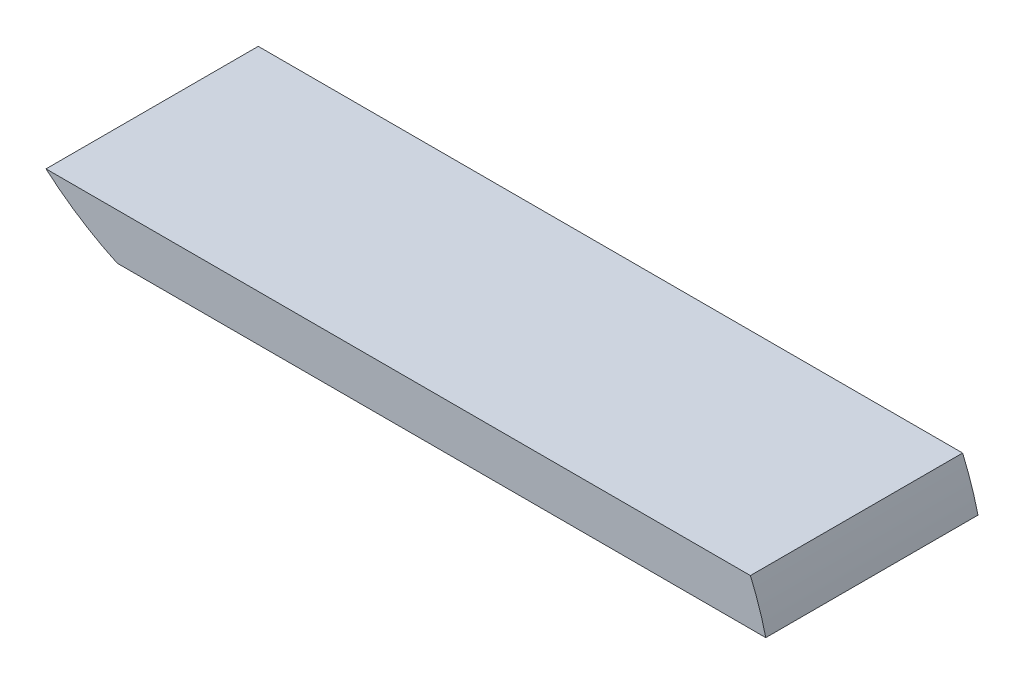
ISO-10303-21;
HEADER;
FILE_DESCRIPTION(('STEP AP214'),'2;1');
FILE_NAME('part.step','',(''),(''),'','','');
FILE_SCHEMA(('AUTOMOTIVE_DESIGN { 1 0 10303 214 1 1 1 1 }'));
ENDSEC;
DATA;
#1=APPLICATION_CONTEXT('core data for automotive mechanical design processes');
#2=APPLICATION_PROTOCOL_DEFINITION('international standard','automotive_design',2000,#1);
#3=PRODUCT_CONTEXT('',#1,'mechanical');
#4=PRODUCT('Part','Part','',(#3));
#5=PRODUCT_RELATED_PRODUCT_CATEGORY('part','',(#4));
#6=PRODUCT_DEFINITION_FORMATION('','',#4);
#7=PRODUCT_DEFINITION_CONTEXT('part definition',#1,'design');
#8=PRODUCT_DEFINITION('design','',#6,#7);
#9=PRODUCT_DEFINITION_SHAPE('','',#8);
#10=(LENGTH_UNIT() NAMED_UNIT(*) SI_UNIT(.MILLI.,.METRE.));
#11=(NAMED_UNIT(*) PLANE_ANGLE_UNIT() SI_UNIT($,.RADIAN.));
#12=(NAMED_UNIT(*) SI_UNIT($,.STERADIAN.) SOLID_ANGLE_UNIT());
#13=UNCERTAINTY_MEASURE_WITH_UNIT(LENGTH_MEASURE(1.E-05),#10,'distance_accuracy_value','');
#14=(GEOMETRIC_REPRESENTATION_CONTEXT(3) GLOBAL_UNCERTAINTY_ASSIGNED_CONTEXT((#13)) GLOBAL_UNIT_ASSIGNED_CONTEXT((#10,
#11,#12)) REPRESENTATION_CONTEXT('',''));
#15=CARTESIAN_POINT('',(0.,0.,0.));
#16=DIRECTION('',(0.,0.,1.));
#17=DIRECTION('',(1.,0.,0.));
#18=AXIS2_PLACEMENT_3D('',#15,#16,#17);
#19=CARTESIAN_POINT('',(-26.649708353736,6.037186226117,0.));
#20=DIRECTION('',(0.,-1.,0.));
#21=DIRECTION('',(1.,0.,0.));
#22=AXIS2_PLACEMENT_3D('',#19,#20,#21);
#23=PLANE('',#22);
#24=DIRECTION('',(1.,0.,0.));
#25=VECTOR('',#24,1.);
#26=CARTESIAN_POINT('',(-26.649708353736,6.037186226117,0.));
#27=LINE('',#26,#25);
#28=CARTESIAN_POINT('',(-26.649708353736,6.037186226117,0.));
#29=VERTEX_POINT('',#28);
#30=CARTESIAN_POINT('',(-26.344127417988,6.037186226117,0.));
#31=VERTEX_POINT('',#30);
#32=EDGE_CURVE('E11',#29,#31,#27,.T.);
#33=ORIENTED_EDGE('',*,*,#32,.T.);
#34=DIRECTION('',(0.,0.,1.));
#35=VECTOR('',#34,1.);
#36=CARTESIAN_POINT('',(-26.344127417988,6.037186226117,0.));
#37=LINE('',#36,#35);
#38=CARTESIAN_POINT('',(-26.344127417988,6.037186226117,0.1));
#39=VERTEX_POINT('',#38);
#40=EDGE_CURVE('E24',#31,#39,#37,.T.);
#41=ORIENTED_EDGE('',*,*,#40,.T.);
#42=DIRECTION('',(1.,0.,0.));
#43=VECTOR('',#42,1.);
#44=CARTESIAN_POINT('',(-26.649708353736,6.037186226117,0.1));
#45=LINE('',#44,#43);
#46=CARTESIAN_POINT('',(-26.649708353736,6.037186226117,0.1));
#47=VERTEX_POINT('',#46);
#48=EDGE_CURVE('E75',#47,#39,#45,.T.);
#49=ORIENTED_EDGE('',*,*,#48,.F.);
#50=DIRECTION('',(0.,0.,1.));
#51=VECTOR('',#50,1.);
#52=CARTESIAN_POINT('',(-26.649708353736,6.037186226117,0.));
#53=LINE('',#52,#51);
#54=EDGE_CURVE('E86',#29,#47,#53,.T.);
#55=ORIENTED_EDGE('',*,*,#54,.F.);
#56=EDGE_LOOP('',(#33,#41,#49,#55));
#57=FACE_BOUND('',#56,.T.);
#58=ADVANCED_FACE('F17',(#57),#23,.T.);
#59=CARTESIAN_POINT('',(-26.590617401597,6.165251438178,0.));
#60=DIRECTION('',(0.,0.,1.));
#61=DIRECTION('',(-0.656943636218161,-0.753939691774123,0.));
#62=AXIS2_PLACEMENT_3D('',#59,#60,#61);
#63=CYLINDRICAL_SURFACE('',#62,0.141040558580501);
#64=CARTESIAN_POINT('',(-26.590617401597,6.165251438178,0.));
#65=DIRECTION('',(0.,0.,1.));
#66=DIRECTION('',(-0.656943636218161,-0.753939691774123,0.));
#67=AXIS2_PLACEMENT_3D('',#64,#65,#66);
#68=CIRCLE('',#67,0.141040558580501);
#69=CARTESIAN_POINT('',(-26.683273099006,6.058915362914,0.));
#70=VERTEX_POINT('',#69);
#71=EDGE_CURVE('E83',#70,#29,#68,.T.);
#72=ORIENTED_EDGE('',*,*,#71,.T.);
#73=ORIENTED_EDGE('',*,*,#54,.T.);
#74=CARTESIAN_POINT('',(-26.590617401597,6.165251438178,0.1));
#75=DIRECTION('',(0.,0.,1.));
#76=DIRECTION('',(-0.656943636218161,-0.753939691774123,0.));
#77=AXIS2_PLACEMENT_3D('',#74,#75,#76);
#78=CIRCLE('',#77,0.141040558580501);
#79=CARTESIAN_POINT('',(-26.683273099006,6.058915362914,0.1));
#80=VERTEX_POINT('',#79);
#81=EDGE_CURVE('E81',#80,#47,#78,.T.);
#82=ORIENTED_EDGE('',*,*,#81,.F.);
#83=DIRECTION('',(0.,0.,1.));
#84=VECTOR('',#83,1.);
#85=CARTESIAN_POINT('',(-26.683273099006,6.058915362914,0.));
#86=LINE('',#85,#84);
#87=EDGE_CURVE('E61',#70,#80,#86,.T.);
#88=ORIENTED_EDGE('',*,*,#87,.F.);
#89=EDGE_LOOP('',(#72,#73,#82,#88));
#90=FACE_BOUND('',#89,.T.);
#91=ADVANCED_FACE('F91',(#90),#63,.T.);
#92=CARTESIAN_POINT('',(-26.351368278438,6.058915362914,0.));
#93=DIRECTION('',(0.,1.,0.));
#94=DIRECTION('',(-1.,0.,0.));
#95=AXIS2_PLACEMENT_3D('',#92,#93,#94);
#96=PLANE('',#95);
#97=DIRECTION('',(-1.,0.,0.));
#98=VECTOR('',#97,1.);
#99=CARTESIAN_POINT('',(-26.351368278438,6.058915362914,0.));
#100=LINE('',#99,#98);
#101=CARTESIAN_POINT('',(-26.351368278438,6.058915362914,0.));
#102=VERTEX_POINT('',#101);
#103=EDGE_CURVE('E65',#102,#70,#100,.T.);
#104=ORIENTED_EDGE('',*,*,#103,.T.);
#105=ORIENTED_EDGE('',*,*,#87,.T.);
#106=DIRECTION('',(-1.,0.,0.));
#107=VECTOR('',#106,1.);
#108=CARTESIAN_POINT('',(-26.351368278438,6.058915362914,0.1));
#109=LINE('',#108,#107);
#110=CARTESIAN_POINT('',(-26.351368278438,6.058915362914,0.1));
#111=VERTEX_POINT('',#110);
#112=EDGE_CURVE('E54',#111,#80,#109,.T.);
#113=ORIENTED_EDGE('',*,*,#112,.F.);
#114=DIRECTION('',(0.,0.,1.));
#115=VECTOR('',#114,1.);
#116=CARTESIAN_POINT('',(-26.351368278438,6.058915362914,0.));
#117=LINE('',#116,#115);
#118=EDGE_CURVE('E58',#102,#111,#117,.T.);
#119=ORIENTED_EDGE('',*,*,#118,.F.);
#120=EDGE_LOOP('',(#104,#105,#113,#119));
#121=FACE_BOUND('',#120,.T.);
#122=ADVANCED_FACE('F57',(#121),#96,.T.);
#123=CARTESIAN_POINT('',(-26.474240487687,6.005899301844,0.));
#124=DIRECTION('',(0.,0.,1.));
#125=DIRECTION('',(0.972285825255403,0.233795367805737,0.));
#126=AXIS2_PLACEMENT_3D('',#123,#124,#125);
#127=CYLINDRICAL_SURFACE('',#126,0.133821831316658);
#128=CARTESIAN_POINT('',(-26.474240487687,6.005899301844,0.));
#129=DIRECTION('',(0.,0.,1.));
#130=DIRECTION('',(0.972285825255403,0.233795367805737,0.));
#131=AXIS2_PLACEMENT_3D('',#128,#129,#130);
#132=CIRCLE('',#131,0.133821831316658);
#133=EDGE_CURVE('E71',#31,#102,#132,.T.);
#134=ORIENTED_EDGE('',*,*,#133,.T.);
#135=ORIENTED_EDGE('',*,*,#118,.T.);
#136=CARTESIAN_POINT('',(-26.474240487687,6.005899301844,0.1));
#137=DIRECTION('',(0.,0.,1.));
#138=DIRECTION('',(0.972285825255403,0.233795367805737,0.));
#139=AXIS2_PLACEMENT_3D('',#136,#137,#138);
#140=CIRCLE('',#139,0.133821831316658);
#141=EDGE_CURVE('E70',#39,#111,#140,.T.);
#142=ORIENTED_EDGE('',*,*,#141,.F.);
#143=ORIENTED_EDGE('',*,*,#40,.F.);
#144=EDGE_LOOP('',(#134,#135,#142,#143));
#145=FACE_BOUND('',#144,.T.);
#146=ADVANCED_FACE('F69',(#145),#127,.T.);
#147=CARTESIAN_POINT('',(-26.510526436725,6.048436037108,0.1));
#148=DIRECTION('',(0.,0.,1.));
#149=DIRECTION('',(1.,0.,0.));
#150=AXIS2_PLACEMENT_3D('',#147,#148,#149);
#151=PLANE('',#150);
#152=ORIENTED_EDGE('',*,*,#141,.T.);
#153=ORIENTED_EDGE('',*,*,#112,.T.);
#154=ORIENTED_EDGE('',*,*,#81,.T.);
#155=ORIENTED_EDGE('',*,*,#48,.T.);
#156=EDGE_LOOP('',(#152,#153,#154,#155));
#157=FACE_BOUND('',#156,.T.);
#158=ADVANCED_FACE('F74',(#157),#151,.T.);
#159=CARTESIAN_POINT('',(-26.510526436725,6.048436037108,0.));
#160=DIRECTION('',(0.,0.,1.));
#161=DIRECTION('',(1.,0.,0.));
#162=AXIS2_PLACEMENT_3D('',#159,#160,#161);
#163=PLANE('',#162);
#164=ORIENTED_EDGE('',*,*,#133,.F.);
#165=ORIENTED_EDGE('',*,*,#32,.F.);
#166=ORIENTED_EDGE('',*,*,#71,.F.);
#167=ORIENTED_EDGE('',*,*,#103,.F.);
#168=EDGE_LOOP('',(#164,#165,#166,#167));
#169=FACE_BOUND('',#168,.T.);
#170=ADVANCED_FACE('F89',(#169),#163,.F.);
#171=CLOSED_SHELL('',(#58,#91,#122,#146,#158,#170));
#172=MANIFOLD_SOLID_BREP('B1',#171);
#173=ADVANCED_BREP_SHAPE_REPRESENTATION('',(#18,#172),#14);
#174=SHAPE_DEFINITION_REPRESENTATION(#9,#173);
ENDSEC;
END-ISO-10303-21;
